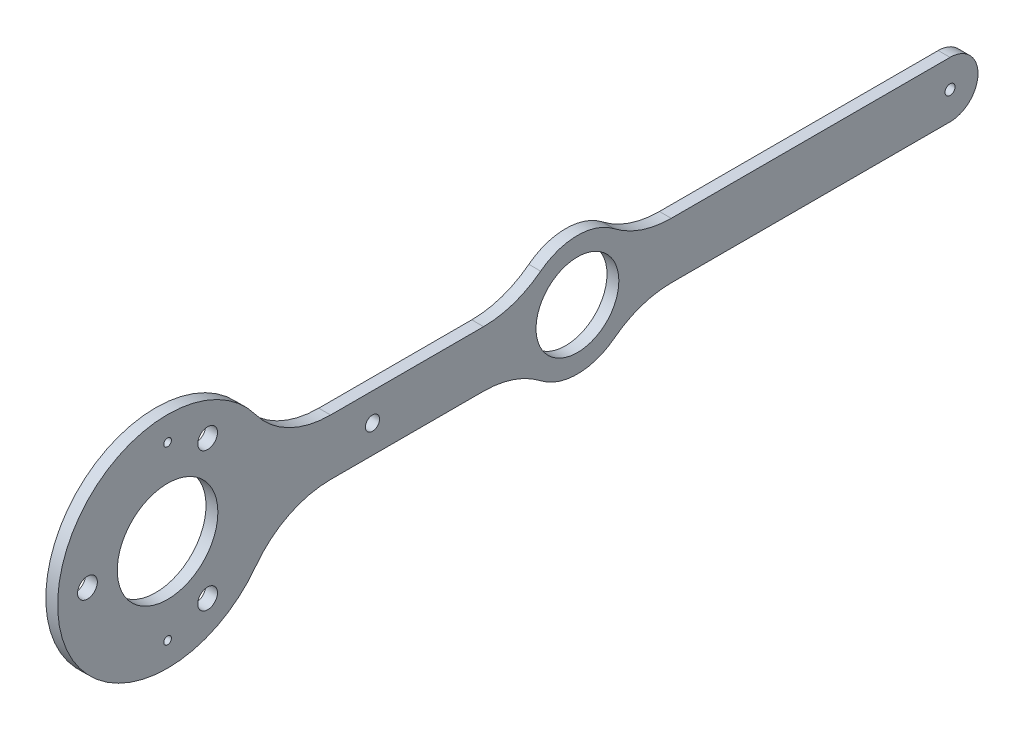
ISO-10303-21;
HEADER;
FILE_DESCRIPTION(('STEP AP214'),'2;1');
FILE_NAME('part.step','',(''),(''),'','','');
FILE_SCHEMA(('AUTOMOTIVE_DESIGN { 1 0 10303 214 1 1 1 1 }'));
ENDSEC;
DATA;
#1=APPLICATION_CONTEXT('core data for automotive mechanical design processes');
#2=APPLICATION_PROTOCOL_DEFINITION('international standard','automotive_design',2000,#1);
#3=PRODUCT_CONTEXT('',#1,'mechanical');
#4=PRODUCT('Part','Part','',(#3));
#5=PRODUCT_RELATED_PRODUCT_CATEGORY('part','',(#4));
#6=PRODUCT_DEFINITION_FORMATION('','',#4);
#7=PRODUCT_DEFINITION_CONTEXT('part definition',#1,'design');
#8=PRODUCT_DEFINITION('design','',#6,#7);
#9=PRODUCT_DEFINITION_SHAPE('','',#8);
#10=(LENGTH_UNIT() NAMED_UNIT(*) SI_UNIT(.MILLI.,.METRE.));
#11=(NAMED_UNIT(*) PLANE_ANGLE_UNIT() SI_UNIT($,.RADIAN.));
#12=(NAMED_UNIT(*) SI_UNIT($,.STERADIAN.) SOLID_ANGLE_UNIT());
#13=UNCERTAINTY_MEASURE_WITH_UNIT(LENGTH_MEASURE(1.E-05),#10,'distance_accuracy_value','');
#14=(GEOMETRIC_REPRESENTATION_CONTEXT(3) GLOBAL_UNCERTAINTY_ASSIGNED_CONTEXT((#13)) GLOBAL_UNIT_ASSIGNED_CONTEXT((#10,
#11,#12)) REPRESENTATION_CONTEXT('',''));
#15=CARTESIAN_POINT('',(0.,0.,0.));
#16=DIRECTION('',(0.,0.,1.));
#17=DIRECTION('',(1.,0.,0.));
#18=AXIS2_PLACEMENT_3D('',#15,#16,#17);
#19=CARTESIAN_POINT('',(3.175,0.,110.));
#20=DIRECTION('',(-1.,0.,0.));
#21=DIRECTION('',(0.,0.,1.));
#22=AXIS2_PLACEMENT_3D('',#19,#20,#21);
#23=CYLINDRICAL_SURFACE('',#22,29.5);
#24=CARTESIAN_POINT('',(3.175,0.,110.));
#25=DIRECTION('',(1.,0.,0.));
#26=DIRECTION('',(0.,0.,-1.));
#27=AXIS2_PLACEMENT_3D('',#24,#25,#26);
#28=CIRCLE('',#27,29.5);
#29=CARTESIAN_POINT('',(3.175,17.5917431192661,86.3191939743227));
#30=VERTEX_POINT('',#29);
#31=CARTESIAN_POINT('',(3.175,-17.5917431192661,86.3191939743227));
#32=VERTEX_POINT('',#31);
#33=EDGE_CURVE('E261',#30,#32,#28,.T.);
#34=ORIENTED_EDGE('',*,*,#33,.F.);
#35=DIRECTION('',(-1.,0.,0.));
#36=VECTOR('',#35,1.);
#37=CARTESIAN_POINT('',(3.175,17.5917431192661,86.3191939743227));
#38=LINE('',#37,#36);
#39=CARTESIAN_POINT('',(0.,17.5917431192661,86.3191939743227));
#40=VERTEX_POINT('',#39);
#41=EDGE_CURVE('E266',#30,#40,#38,.T.);
#42=ORIENTED_EDGE('',*,*,#41,.T.);
#43=CARTESIAN_POINT('',(0.,0.,110.));
#44=DIRECTION('',(1.,0.,0.));
#45=DIRECTION('',(0.,0.,-1.));
#46=AXIS2_PLACEMENT_3D('',#43,#44,#45);
#47=CIRCLE('',#46,29.5);
#48=CARTESIAN_POINT('',(0.,-17.5917431192661,86.3191939743227));
#49=VERTEX_POINT('',#48);
#50=EDGE_CURVE('E212',#40,#49,#47,.T.);
#51=ORIENTED_EDGE('',*,*,#50,.T.);
#52=DIRECTION('',(-1.,0.,0.));
#53=VECTOR('',#52,1.);
#54=CARTESIAN_POINT('',(3.175,-17.5917431192661,86.3191939743227));
#55=LINE('',#54,#53);
#56=EDGE_CURVE('E171',#49,#32,#55,.F.);
#57=ORIENTED_EDGE('',*,*,#56,.T.);
#58=EDGE_LOOP('',(#34,#42,#51,#57));
#59=FACE_BOUND('',#58,.T.);
#60=ADVANCED_FACE('F45',(#59),#23,.T.);
#61=CARTESIAN_POINT('',(3.175,-7.5,0.));
#62=DIRECTION('',(0.,1.,0.));
#63=DIRECTION('',(0.,0.,1.));
#64=AXIS2_PLACEMENT_3D('',#61,#62,#63);
#65=PLANE('',#64);
#66=DIRECTION('',(0.,0.,-1.));
#67=VECTOR('',#66,1.);
#68=CARTESIAN_POINT('',(3.175,-7.5,0.));
#69=LINE('',#68,#67);
#70=CARTESIAN_POINT('',(3.175,-7.5,66.2507142915453));
#71=VERTEX_POINT('',#70);
#72=CARTESIAN_POINT('',(3.175,-7.5,25.1791115063657));
#73=VERTEX_POINT('',#72);
#74=EDGE_CURVE('E356',#71,#73,#69,.T.);
#75=ORIENTED_EDGE('',*,*,#74,.F.);
#76=DIRECTION('',(1.,0.,0.));
#77=VECTOR('',#76,1.);
#78=CARTESIAN_POINT('',(0.,-7.5,66.2507142915453));
#79=LINE('',#78,#77);
#80=CARTESIAN_POINT('',(0.,-7.5,66.2507142915453));
#81=VERTEX_POINT('',#80);
#82=EDGE_CURVE('E280',#71,#81,#79,.F.);
#83=ORIENTED_EDGE('',*,*,#82,.T.);
#84=DIRECTION('',(0.,0.,-1.));
#85=VECTOR('',#84,1.);
#86=CARTESIAN_POINT('',(0.,-7.5,0.));
#87=LINE('',#86,#85);
#88=CARTESIAN_POINT('',(0.,-7.5,25.1791115063657));
#89=VERTEX_POINT('',#88);
#90=EDGE_CURVE('E216',#81,#89,#87,.T.);
#91=ORIENTED_EDGE('',*,*,#90,.T.);
#92=DIRECTION('',(1.,0.,0.));
#93=VECTOR('',#92,1.);
#94=CARTESIAN_POINT('',(3.175,-7.5,25.1791115063657));
#95=LINE('',#94,#93);
#96=EDGE_CURVE('E277',#89,#73,#95,.T.);
#97=ORIENTED_EDGE('',*,*,#96,.T.);
#98=EDGE_LOOP('',(#75,#83,#91,#97));
#99=FACE_BOUND('',#98,.T.);
#100=ADVANCED_FACE('F384',(#99),#65,.F.);
#101=CARTESIAN_POINT('',(3.175,0.,0.));
#102=DIRECTION('',(-1.,0.,0.));
#103=DIRECTION('',(0.,0.,1.));
#104=AXIS2_PLACEMENT_3D('',#101,#102,#103);
#105=CYLINDRICAL_SURFACE('',#104,16.1125);
#106=CARTESIAN_POINT('',(3.175,0.,0.));
#107=DIRECTION('',(1.,0.,0.));
#108=DIRECTION('',(0.,0.,-1.));
#109=AXIS2_PLACEMENT_3D('',#106,#107,#108);
#110=CIRCLE('',#109,16.1125);
#111=CARTESIAN_POINT('',(3.175,-12.7371541501976,9.86800691143369));
#112=VERTEX_POINT('',#111);
#113=CARTESIAN_POINT('',(3.175,-12.7371541501976,-9.8680069114337));
#114=VERTEX_POINT('',#113);
#115=EDGE_CURVE('E160',#112,#114,#110,.T.);
#116=ORIENTED_EDGE('',*,*,#115,.F.);
#117=DIRECTION('',(-1.,0.,0.));
#118=VECTOR('',#117,1.);
#119=CARTESIAN_POINT('',(3.175,-12.7371541501976,9.86800691143369));
#120=LINE('',#119,#118);
#121=CARTESIAN_POINT('',(0.,-12.7371541501976,9.86800691143369));
#122=VERTEX_POINT('',#121);
#123=EDGE_CURVE('E287',#112,#122,#120,.T.);
#124=ORIENTED_EDGE('',*,*,#123,.T.);
#125=CARTESIAN_POINT('',(0.,0.,0.));
#126=DIRECTION('',(1.,0.,0.));
#127=DIRECTION('',(0.,0.,-1.));
#128=AXIS2_PLACEMENT_3D('',#125,#126,#127);
#129=CIRCLE('',#128,16.1125);
#130=CARTESIAN_POINT('',(0.,-12.7371541501976,-9.8680069114337));
#131=VERTEX_POINT('',#130);
#132=EDGE_CURVE('E221',#122,#131,#129,.T.);
#133=ORIENTED_EDGE('',*,*,#132,.T.);
#134=DIRECTION('',(-1.,0.,0.));
#135=VECTOR('',#134,1.);
#136=CARTESIAN_POINT('',(3.175,-12.7371541501976,-9.8680069114337));
#137=LINE('',#136,#135);
#138=EDGE_CURVE('E284',#131,#114,#137,.F.);
#139=ORIENTED_EDGE('',*,*,#138,.T.);
#140=EDGE_LOOP('',(#116,#124,#133,#139));
#141=FACE_BOUND('',#140,.T.);
#142=ADVANCED_FACE('F389',(#141),#105,.T.);
#143=CARTESIAN_POINT('',(3.175,-7.50000000000001,0.));
#144=DIRECTION('',(0.,1.,0.));
#145=DIRECTION('',(0.,0.,1.));
#146=AXIS2_PLACEMENT_3D('',#143,#144,#145);
#147=PLANE('',#146);
#148=DIRECTION('',(0.,0.,-1.));
#149=VECTOR('',#148,1.);
#150=CARTESIAN_POINT('',(3.175,-7.50000000000001,0.));
#151=LINE('',#150,#149);
#152=CARTESIAN_POINT('',(3.175,-7.5,-25.1791115063657));
#153=VERTEX_POINT('',#152);
#154=CARTESIAN_POINT('',(3.175,-7.49999999999996,-100.));
#155=VERTEX_POINT('',#154);
#156=EDGE_CURVE('E146',#153,#155,#151,.T.);
#157=ORIENTED_EDGE('',*,*,#156,.F.);
#158=DIRECTION('',(1.,0.,0.));
#159=VECTOR('',#158,1.);
#160=CARTESIAN_POINT('',(0.,-7.5,-25.1791115063657));
#161=LINE('',#160,#159);
#162=CARTESIAN_POINT('',(0.,-7.5,-25.1791115063657));
#163=VERTEX_POINT('',#162);
#164=EDGE_CURVE('E291',#153,#163,#161,.F.);
#165=ORIENTED_EDGE('',*,*,#164,.T.);
#166=DIRECTION('',(0.,0.,-1.));
#167=VECTOR('',#166,1.);
#168=CARTESIAN_POINT('',(0.,-7.50000000000001,0.));
#169=LINE('',#168,#167);
#170=CARTESIAN_POINT('',(0.,-7.49999999999996,-100.));
#171=VERTEX_POINT('',#170);
#172=EDGE_CURVE('E166',#163,#171,#169,.T.);
#173=ORIENTED_EDGE('',*,*,#172,.T.);
#174=DIRECTION('',(-1.,0.,0.));
#175=VECTOR('',#174,1.);
#176=CARTESIAN_POINT('',(3.175,-7.49999999999996,-100.));
#177=LINE('',#176,#175);
#178=EDGE_CURVE('E163',#155,#171,#177,.T.);
#179=ORIENTED_EDGE('',*,*,#178,.F.);
#180=EDGE_LOOP('',(#157,#165,#173,#179));
#181=FACE_BOUND('',#180,.T.);
#182=ADVANCED_FACE('F164',(#181),#147,.F.);
#183=CARTESIAN_POINT('',(3.175,0.,-100.));
#184=DIRECTION('',(-1.,0.,0.));
#185=DIRECTION('',(0.,0.,1.));
#186=AXIS2_PLACEMENT_3D('',#183,#184,#185);
#187=CYLINDRICAL_SURFACE('',#186,7.5);
#188=CARTESIAN_POINT('',(0.,0.,-100.));
#189=DIRECTION('',(1.,0.,0.));
#190=DIRECTION('',(0.,0.,-1.));
#191=AXIS2_PLACEMENT_3D('',#188,#189,#190);
#192=CIRCLE('',#191,7.5);
#193=CARTESIAN_POINT('',(0.,7.50000000000004,-100.));
#194=VERTEX_POINT('',#193);
#195=EDGE_CURVE('E227',#194,#171,#192,.F.);
#196=ORIENTED_EDGE('',*,*,#195,.F.);
#197=DIRECTION('',(-1.,0.,0.));
#198=VECTOR('',#197,1.);
#199=CARTESIAN_POINT('',(3.175,7.50000000000004,-100.));
#200=LINE('',#199,#198);
#201=CARTESIAN_POINT('',(3.175,7.50000000000004,-100.));
#202=VERTEX_POINT('',#201);
#203=EDGE_CURVE('E172',#202,#194,#200,.T.);
#204=ORIENTED_EDGE('',*,*,#203,.F.);
#205=CARTESIAN_POINT('',(3.175,0.,-100.));
#206=DIRECTION('',(1.,0.,0.));
#207=DIRECTION('',(0.,0.,-1.));
#208=AXIS2_PLACEMENT_3D('',#205,#206,#207);
#209=CIRCLE('',#208,7.5);
#210=EDGE_CURVE('E152',#202,#155,#209,.F.);
#211=ORIENTED_EDGE('',*,*,#210,.T.);
#212=ORIENTED_EDGE('',*,*,#178,.T.);
#213=EDGE_LOOP('',(#196,#204,#211,#212));
#214=FACE_BOUND('',#213,.T.);
#215=ADVANCED_FACE('F175',(#214),#187,.T.);
#216=CARTESIAN_POINT('',(3.175,7.49999999999999,0.));
#217=DIRECTION('',(0.,1.,0.));
#218=DIRECTION('',(0.,0.,1.));
#219=AXIS2_PLACEMENT_3D('',#216,#217,#218);
#220=PLANE('',#219);
#221=DIRECTION('',(0.,0.,-1.));
#222=VECTOR('',#221,1.);
#223=CARTESIAN_POINT('',(0.,7.49999999999999,0.));
#224=LINE('',#223,#222);
#225=CARTESIAN_POINT('',(0.,7.5,-25.1791115063658));
#226=VERTEX_POINT('',#225);
#227=EDGE_CURVE('E230',#226,#194,#224,.T.);
#228=ORIENTED_EDGE('',*,*,#227,.F.);
#229=DIRECTION('',(-1.,0.,0.));
#230=VECTOR('',#229,1.);
#231=CARTESIAN_POINT('',(3.175,7.5,-25.1791115063658));
#232=LINE('',#231,#230);
#233=CARTESIAN_POINT('',(3.175,7.5,-25.1791115063658));
#234=VERTEX_POINT('',#233);
#235=EDGE_CURVE('E61',#226,#234,#232,.F.);
#236=ORIENTED_EDGE('',*,*,#235,.T.);
#237=DIRECTION('',(0.,0.,-1.));
#238=VECTOR('',#237,1.);
#239=CARTESIAN_POINT('',(3.175,7.49999999999999,0.));
#240=LINE('',#239,#238);
#241=EDGE_CURVE('E178',#234,#202,#240,.T.);
#242=ORIENTED_EDGE('',*,*,#241,.T.);
#243=ORIENTED_EDGE('',*,*,#203,.T.);
#244=EDGE_LOOP('',(#228,#236,#242,#243));
#245=FACE_BOUND('',#244,.T.);
#246=ADVANCED_FACE('F372',(#245),#220,.T.);
#247=CARTESIAN_POINT('',(3.175,0.,0.));
#248=DIRECTION('',(-1.,0.,0.));
#249=DIRECTION('',(0.,0.,1.));
#250=AXIS2_PLACEMENT_3D('',#247,#248,#249);
#251=CYLINDRICAL_SURFACE('',#250,16.1125);
#252=CARTESIAN_POINT('',(3.175,0.,0.));
#253=DIRECTION('',(1.,0.,0.));
#254=DIRECTION('',(0.,0.,-1.));
#255=AXIS2_PLACEMENT_3D('',#252,#253,#254);
#256=CIRCLE('',#255,16.1125);
#257=CARTESIAN_POINT('',(3.175,12.7371541501976,-9.8680069114337));
#258=VERTEX_POINT('',#257);
#259=CARTESIAN_POINT('',(3.175,12.7371541501976,9.8680069114337));
#260=VERTEX_POINT('',#259);
#261=EDGE_CURVE('E181',#258,#260,#256,.T.);
#262=ORIENTED_EDGE('',*,*,#261,.F.);
#263=DIRECTION('',(-1.,0.,0.));
#264=VECTOR('',#263,1.);
#265=CARTESIAN_POINT('',(3.175,12.7371541501976,-9.86800691143369));
#266=LINE('',#265,#264);
#267=CARTESIAN_POINT('',(0.,12.7371541501976,-9.8680069114337));
#268=VERTEX_POINT('',#267);
#269=EDGE_CURVE('E297',#258,#268,#266,.T.);
#270=ORIENTED_EDGE('',*,*,#269,.T.);
#271=CARTESIAN_POINT('',(0.,0.,0.));
#272=DIRECTION('',(1.,0.,0.));
#273=DIRECTION('',(0.,0.,-1.));
#274=AXIS2_PLACEMENT_3D('',#271,#272,#273);
#275=CIRCLE('',#274,16.1125);
#276=CARTESIAN_POINT('',(0.,12.7371541501976,9.8680069114337));
#277=VERTEX_POINT('',#276);
#278=EDGE_CURVE('E233',#268,#277,#275,.T.);
#279=ORIENTED_EDGE('',*,*,#278,.T.);
#280=DIRECTION('',(-1.,0.,0.));
#281=VECTOR('',#280,1.);
#282=CARTESIAN_POINT('',(3.175,12.7371541501976,9.8680069114337));
#283=LINE('',#282,#281);
#284=EDGE_CURVE('E294',#277,#260,#283,.F.);
#285=ORIENTED_EDGE('',*,*,#284,.T.);
#286=EDGE_LOOP('',(#262,#270,#279,#285));
#287=FACE_BOUND('',#286,.T.);
#288=ADVANCED_FACE('F340',(#287),#251,.T.);
#289=CARTESIAN_POINT('',(3.175,-1.90914435981862E-13,131.5));
#290=DIRECTION('',(-1.,0.,0.));
#291=DIRECTION('',(0.,0.,1.));
#292=AXIS2_PLACEMENT_3D('',#289,#290,#291);
#293=CYLINDRICAL_SURFACE('',#292,2.65000000000007);
#294=CARTESIAN_POINT('',(3.175,-1.90914435981862E-13,131.5));
#295=DIRECTION('',(1.,0.,0.));
#296=DIRECTION('',(0.,0.,-1.));
#297=AXIS2_PLACEMENT_3D('',#294,#295,#296);
#298=CIRCLE('',#297,2.65000000000007);
#299=CARTESIAN_POINT('',(3.175,-1.90914435981862E-13,128.85));
#300=VERTEX_POINT('',#299);
#301=EDGE_CURVE('E204',#300,#300,#298,.T.);
#302=ORIENTED_EDGE('',*,*,#301,.T.);
#303=EDGE_LOOP('',(#302));
#304=FACE_BOUND('',#303,.T.);
#305=CARTESIAN_POINT('',(0.,-1.90914435981862E-13,131.5));
#306=DIRECTION('',(1.,0.,0.));
#307=DIRECTION('',(0.,0.,-1.));
#308=AXIS2_PLACEMENT_3D('',#305,#306,#307);
#309=CIRCLE('',#308,2.65000000000007);
#310=CARTESIAN_POINT('',(0.,-1.90914435981862E-13,128.85));
#311=VERTEX_POINT('',#310);
#312=EDGE_CURVE('E253',#311,#311,#309,.T.);
#313=ORIENTED_EDGE('',*,*,#312,.F.);
#314=EDGE_LOOP('',(#313));
#315=FACE_BOUND('',#314,.T.);
#316=ADVANCED_FACE('F421',(#304,#315),#293,.F.);
#317=CARTESIAN_POINT('',(3.175,18.6195461813655,99.2500000000002));
#318=DIRECTION('',(-1.,0.,0.));
#319=DIRECTION('',(0.,0.,1.));
#320=AXIS2_PLACEMENT_3D('',#317,#318,#319);
#321=CYLINDRICAL_SURFACE('',#320,2.65000000000004);
#322=CARTESIAN_POINT('',(3.175,18.6195461813655,99.2500000000002));
#323=DIRECTION('',(1.,0.,0.));
#324=DIRECTION('',(0.,0.,-1.));
#325=AXIS2_PLACEMENT_3D('',#322,#323,#324);
#326=CIRCLE('',#325,2.65000000000004);
#327=CARTESIAN_POINT('',(3.175,18.6195461813655,96.6000000000002));
#328=VERTEX_POINT('',#327);
#329=EDGE_CURVE('E200',#328,#328,#326,.T.);
#330=ORIENTED_EDGE('',*,*,#329,.T.);
#331=EDGE_LOOP('',(#330));
#332=FACE_BOUND('',#331,.T.);
#333=CARTESIAN_POINT('',(0.,18.6195461813655,99.2500000000002));
#334=DIRECTION('',(1.,0.,0.));
#335=DIRECTION('',(0.,0.,-1.));
#336=AXIS2_PLACEMENT_3D('',#333,#334,#335);
#337=CIRCLE('',#336,2.65000000000004);
#338=CARTESIAN_POINT('',(0.,18.6195461813655,96.6000000000002));
#339=VERTEX_POINT('',#338);
#340=EDGE_CURVE('E249',#339,#339,#337,.T.);
#341=ORIENTED_EDGE('',*,*,#340,.F.);
#342=EDGE_LOOP('',(#341));
#343=FACE_BOUND('',#342,.T.);
#344=ADVANCED_FACE('F432',(#332,#343),#321,.F.);
#345=CARTESIAN_POINT('',(3.175,0.,110.));
#346=DIRECTION('',(-1.,0.,0.));
#347=DIRECTION('',(0.,0.,1.));
#348=AXIS2_PLACEMENT_3D('',#345,#346,#347);
#349=CYLINDRICAL_SURFACE('',#348,13.5);
#350=CARTESIAN_POINT('',(3.175,0.,110.));
#351=DIRECTION('',(1.,0.,0.));
#352=DIRECTION('',(0.,0.,-1.));
#353=AXIS2_PLACEMENT_3D('',#350,#351,#352);
#354=CIRCLE('',#353,13.5);
#355=CARTESIAN_POINT('',(3.175,0.,96.5));
#356=VERTEX_POINT('',#355);
#357=EDGE_CURVE('E196',#356,#356,#354,.T.);
#358=ORIENTED_EDGE('',*,*,#357,.T.);
#359=EDGE_LOOP('',(#358));
#360=FACE_BOUND('',#359,.T.);
#361=CARTESIAN_POINT('',(0.,0.,110.));
#362=DIRECTION('',(1.,0.,0.));
#363=DIRECTION('',(0.,0.,-1.));
#364=AXIS2_PLACEMENT_3D('',#361,#362,#363);
#365=CIRCLE('',#364,13.5);
#366=CARTESIAN_POINT('',(0.,0.,96.5));
#367=VERTEX_POINT('',#366);
#368=EDGE_CURVE('E245',#367,#367,#365,.T.);
#369=ORIENTED_EDGE('',*,*,#368,.F.);
#370=EDGE_LOOP('',(#369));
#371=FACE_BOUND('',#370,.T.);
#372=ADVANCED_FACE('F428',(#360,#371),#349,.F.);
#373=CARTESIAN_POINT('',(3.175,0.,0.));
#374=DIRECTION('',(-1.,0.,0.));
#375=DIRECTION('',(0.,0.,1.));
#376=AXIS2_PLACEMENT_3D('',#373,#374,#375);
#377=CYLINDRICAL_SURFACE('',#376,11.1125);
#378=CARTESIAN_POINT('',(3.175,0.,0.));
#379=DIRECTION('',(1.,0.,0.));
#380=DIRECTION('',(0.,0.,-1.));
#381=AXIS2_PLACEMENT_3D('',#378,#379,#380);
#382=CIRCLE('',#381,11.1125);
#383=CARTESIAN_POINT('',(3.175,0.,-11.1125));
#384=VERTEX_POINT('',#383);
#385=EDGE_CURVE('E192',#384,#384,#382,.T.);
#386=ORIENTED_EDGE('',*,*,#385,.T.);
#387=EDGE_LOOP('',(#386));
#388=FACE_BOUND('',#387,.T.);
#389=CARTESIAN_POINT('',(0.,0.,0.));
#390=DIRECTION('',(1.,0.,0.));
#391=DIRECTION('',(0.,0.,-1.));
#392=AXIS2_PLACEMENT_3D('',#389,#390,#391);
#393=CIRCLE('',#392,11.1125);
#394=CARTESIAN_POINT('',(0.,0.,-11.1125));
#395=VERTEX_POINT('',#394);
#396=EDGE_CURVE('E241',#395,#395,#393,.T.);
#397=ORIENTED_EDGE('',*,*,#396,.F.);
#398=EDGE_LOOP('',(#397));
#399=FACE_BOUND('',#398,.T.);
#400=ADVANCED_FACE('F425',(#388,#399),#377,.F.);
#401=CARTESIAN_POINT('',(3.175,7.5,0.));
#402=DIRECTION('',(0.,1.,0.));
#403=DIRECTION('',(0.,0.,1.));
#404=AXIS2_PLACEMENT_3D('',#401,#402,#403);
#405=PLANE('',#404);
#406=DIRECTION('',(0.,0.,-1.));
#407=VECTOR('',#406,1.);
#408=CARTESIAN_POINT('',(0.,7.5,0.));
#409=LINE('',#408,#407);
#410=CARTESIAN_POINT('',(0.,7.5,66.2507142915453));
#411=VERTEX_POINT('',#410);
#412=CARTESIAN_POINT('',(0.,7.5,25.1791115063657));
#413=VERTEX_POINT('',#412);
#414=EDGE_CURVE('E237',#411,#413,#409,.T.);
#415=ORIENTED_EDGE('',*,*,#414,.F.);
#416=DIRECTION('',(-1.,0.,0.));
#417=VECTOR('',#416,1.);
#418=CARTESIAN_POINT('',(3.175,7.5,66.2507142915453));
#419=LINE('',#418,#417);
#420=CARTESIAN_POINT('',(3.175,7.5,66.2507142915453));
#421=VERTEX_POINT('',#420);
#422=EDGE_CURVE('E274',#411,#421,#419,.F.);
#423=ORIENTED_EDGE('',*,*,#422,.T.);
#424=DIRECTION('',(0.,0.,-1.));
#425=VECTOR('',#424,1.);
#426=CARTESIAN_POINT('',(3.175,7.5,0.));
#427=LINE('',#426,#425);
#428=CARTESIAN_POINT('',(3.175,7.5,25.1791115063657));
#429=VERTEX_POINT('',#428);
#430=EDGE_CURVE('E188',#421,#429,#427,.T.);
#431=ORIENTED_EDGE('',*,*,#430,.T.);
#432=DIRECTION('',(-1.,0.,0.));
#433=VECTOR('',#432,1.);
#434=CARTESIAN_POINT('',(3.175,7.5,25.1791115063657));
#435=LINE('',#434,#433);
#436=EDGE_CURVE('E270',#429,#413,#435,.T.);
#437=ORIENTED_EDGE('',*,*,#436,.T.);
#438=EDGE_LOOP('',(#415,#423,#431,#437));
#439=FACE_BOUND('',#438,.T.);
#440=ADVANCED_FACE('F345',(#439),#405,.T.);
#441=CARTESIAN_POINT('',(3.175,-18.6195461813653,99.2499999999998));
#442=DIRECTION('',(-1.,0.,0.));
#443=DIRECTION('',(0.,0.,1.));
#444=AXIS2_PLACEMENT_3D('',#441,#442,#443);
#445=CYLINDRICAL_SURFACE('',#444,2.64999999999999);
#446=CARTESIAN_POINT('',(3.175,-18.6195461813653,99.2499999999998));
#447=DIRECTION('',(1.,0.,0.));
#448=DIRECTION('',(0.,0.,-1.));
#449=AXIS2_PLACEMENT_3D('',#446,#447,#448);
#450=CIRCLE('',#449,2.64999999999999);
#451=CARTESIAN_POINT('',(3.175,-18.6195461813653,96.5999999999998));
#452=VERTEX_POINT('',#451);
#453=EDGE_CURVE('E208',#452,#452,#450,.T.);
#454=ORIENTED_EDGE('',*,*,#453,.T.);
#455=EDGE_LOOP('',(#454));
#456=FACE_BOUND('',#455,.T.);
#457=CARTESIAN_POINT('',(0.,-18.6195461813653,99.2499999999998));
#458=DIRECTION('',(1.,0.,0.));
#459=DIRECTION('',(0.,0.,-1.));
#460=AXIS2_PLACEMENT_3D('',#457,#458,#459);
#461=CIRCLE('',#460,2.64999999999999);
#462=CARTESIAN_POINT('',(0.,-18.6195461813653,96.5999999999998));
#463=VERTEX_POINT('',#462);
#464=EDGE_CURVE('E257',#463,#463,#461,.T.);
#465=ORIENTED_EDGE('',*,*,#464,.F.);
#466=EDGE_LOOP('',(#465));
#467=FACE_BOUND('',#466,.T.);
#468=ADVANCED_FACE('F424',(#456,#467),#445,.F.);
#469=CARTESIAN_POINT('',(3.175,0.,0.));
#470=DIRECTION('',(1.,0.,0.));
#471=DIRECTION('',(0.,0.,-1.));
#472=AXIS2_PLACEMENT_3D('',#469,#470,#471);
#473=PLANE('',#472);
#474=CARTESIAN_POINT('',(3.175,0.,-100.));
#475=DIRECTION('',(1.,0.,0.));
#476=DIRECTION('',(0.,0.,-1.));
#477=AXIS2_PLACEMENT_3D('',#474,#475,#476);
#478=CIRCLE('',#477,1.35254999999999);
#479=CARTESIAN_POINT('',(3.175,0.,-101.35255));
#480=VERTEX_POINT('',#479);
#481=EDGE_CURVE('E471',#480,#480,#478,.T.);
#482=ORIENTED_EDGE('',*,*,#481,.F.);
#483=EDGE_LOOP('',(#482));
#484=FACE_BOUND('',#483,.T.);
#485=CARTESIAN_POINT('',(3.175,0.,55.));
#486=DIRECTION('',(1.,0.,0.));
#487=DIRECTION('',(0.,0.,-1.));
#488=AXIS2_PLACEMENT_3D('',#485,#486,#487);
#489=CIRCLE('',#488,1.89864999999999);
#490=CARTESIAN_POINT('',(3.175,0.,53.10135));
#491=VERTEX_POINT('',#490);
#492=EDGE_CURVE('E475',#491,#491,#489,.T.);
#493=ORIENTED_EDGE('',*,*,#492,.F.);
#494=EDGE_LOOP('',(#493));
#495=FACE_BOUND('',#494,.T.);
#496=CARTESIAN_POINT('',(3.175,23.015,110.));
#497=DIRECTION('',(1.,0.,0.));
#498=DIRECTION('',(0.,0.,-1.));
#499=AXIS2_PLACEMENT_3D('',#496,#497,#498);
#500=CIRCLE('',#499,1.02499999999999);
#501=CARTESIAN_POINT('',(3.175,23.015,108.975));
#502=VERTEX_POINT('',#501);
#503=EDGE_CURVE('E485',#502,#502,#500,.T.);
#504=ORIENTED_EDGE('',*,*,#503,.F.);
#505=EDGE_LOOP('',(#504));
#506=FACE_BOUND('',#505,.T.);
#507=CARTESIAN_POINT('',(3.175,-23.015,110.));
#508=DIRECTION('',(1.,0.,0.));
#509=DIRECTION('',(0.,0.,-1.));
#510=AXIS2_PLACEMENT_3D('',#507,#508,#509);
#511=CIRCLE('',#510,1.02499999999999);
#512=CARTESIAN_POINT('',(3.175,-23.015,108.975));
#513=VERTEX_POINT('',#512);
#514=EDGE_CURVE('E492',#513,#513,#511,.T.);
#515=ORIENTED_EDGE('',*,*,#514,.F.);
#516=EDGE_LOOP('',(#515));
#517=FACE_BOUND('',#516,.T.);
#518=ORIENTED_EDGE('',*,*,#430,.F.);
#519=CARTESIAN_POINT('',(3.175,32.5,66.2507142915453));
#520=DIRECTION('',(1.,0.,0.));
#521=DIRECTION('',(0.,0.,-1.));
#522=AXIS2_PLACEMENT_3D('',#519,#520,#521);
#523=CIRCLE('',#522,25.);
#524=EDGE_CURVE('E306',#421,#30,#523,.F.);
#525=ORIENTED_EDGE('',*,*,#524,.T.);
#526=ORIENTED_EDGE('',*,*,#33,.T.);
#527=CARTESIAN_POINT('',(3.175,-32.5,66.2507142915453));
#528=DIRECTION('',(1.,0.,0.));
#529=DIRECTION('',(0.,0.,-1.));
#530=AXIS2_PLACEMENT_3D('',#527,#528,#529);
#531=CIRCLE('',#530,25.);
#532=EDGE_CURVE('E312',#32,#71,#531,.F.);
#533=ORIENTED_EDGE('',*,*,#532,.T.);
#534=ORIENTED_EDGE('',*,*,#74,.T.);
#535=CARTESIAN_POINT('',(3.175,-32.5,25.1791115063657));
#536=DIRECTION('',(1.,0.,0.));
#537=DIRECTION('',(0.,0.,-1.));
#538=AXIS2_PLACEMENT_3D('',#535,#536,#537);
#539=CIRCLE('',#538,25.);
#540=EDGE_CURVE('E318',#73,#112,#539,.F.);
#541=ORIENTED_EDGE('',*,*,#540,.T.);
#542=ORIENTED_EDGE('',*,*,#115,.T.);
#543=CARTESIAN_POINT('',(3.175,-32.5,-25.1791115063657));
#544=DIRECTION('',(1.,0.,0.));
#545=DIRECTION('',(0.,0.,-1.));
#546=AXIS2_PLACEMENT_3D('',#543,#544,#545);
#547=CIRCLE('',#546,25.);
#548=EDGE_CURVE('E155',#114,#153,#547,.F.);
#549=ORIENTED_EDGE('',*,*,#548,.T.);
#550=ORIENTED_EDGE('',*,*,#156,.T.);
#551=ORIENTED_EDGE('',*,*,#210,.F.);
#552=ORIENTED_EDGE('',*,*,#241,.F.);
#553=CARTESIAN_POINT('',(3.175,32.5,-25.1791115063657));
#554=DIRECTION('',(1.,0.,0.));
#555=DIRECTION('',(0.,0.,-1.));
#556=AXIS2_PLACEMENT_3D('',#553,#554,#555);
#557=CIRCLE('',#556,25.);
#558=EDGE_CURVE('E328',#234,#258,#557,.F.);
#559=ORIENTED_EDGE('',*,*,#558,.T.);
#560=ORIENTED_EDGE('',*,*,#261,.T.);
#561=CARTESIAN_POINT('',(3.175,32.5,25.1791115063657));
#562=DIRECTION('',(1.,0.,0.));
#563=DIRECTION('',(0.,0.,-1.));
#564=AXIS2_PLACEMENT_3D('',#561,#562,#563);
#565=CIRCLE('',#564,25.);
#566=EDGE_CURVE('E11',#260,#429,#565,.F.);
#567=ORIENTED_EDGE('',*,*,#566,.T.);
#568=EDGE_LOOP('',(#518,#525,#526,#533,#534,#541,#542,#549,#550,#551,#552,#559,#560,#567));
#569=FACE_BOUND('',#568,.T.);
#570=ORIENTED_EDGE('',*,*,#385,.F.);
#571=EDGE_LOOP('',(#570));
#572=FACE_BOUND('',#571,.T.);
#573=ORIENTED_EDGE('',*,*,#357,.F.);
#574=EDGE_LOOP('',(#573));
#575=FACE_BOUND('',#574,.T.);
#576=ORIENTED_EDGE('',*,*,#329,.F.);
#577=EDGE_LOOP('',(#576));
#578=FACE_BOUND('',#577,.T.);
#579=ORIENTED_EDGE('',*,*,#301,.F.);
#580=EDGE_LOOP('',(#579));
#581=FACE_BOUND('',#580,.T.);
#582=ORIENTED_EDGE('',*,*,#453,.F.);
#583=EDGE_LOOP('',(#582));
#584=FACE_BOUND('',#583,.T.);
#585=ADVANCED_FACE('F149',(#484,#495,#506,#517,#569,#572,#575,#578,#581,#584),#473,.T.);
#586=CARTESIAN_POINT('',(0.,0.,0.));
#587=DIRECTION('',(1.,0.,0.));
#588=DIRECTION('',(0.,0.,-1.));
#589=AXIS2_PLACEMENT_3D('',#586,#587,#588);
#590=PLANE('',#589);
#591=CARTESIAN_POINT('',(0.,0.,-100.));
#592=DIRECTION('',(1.,0.,0.));
#593=DIRECTION('',(0.,0.,-1.));
#594=AXIS2_PLACEMENT_3D('',#591,#592,#593);
#595=CIRCLE('',#594,1.35254999999999);
#596=CARTESIAN_POINT('',(0.,0.,-101.35255));
#597=VERTEX_POINT('',#596);
#598=EDGE_CURVE('E468',#597,#597,#595,.T.);
#599=ORIENTED_EDGE('',*,*,#598,.T.);
#600=EDGE_LOOP('',(#599));
#601=FACE_BOUND('',#600,.T.);
#602=CARTESIAN_POINT('',(0.,0.,55.));
#603=DIRECTION('',(1.,0.,0.));
#604=DIRECTION('',(0.,0.,-1.));
#605=AXIS2_PLACEMENT_3D('',#602,#603,#604);
#606=CIRCLE('',#605,1.89864999999999);
#607=CARTESIAN_POINT('',(0.,0.,53.10135));
#608=VERTEX_POINT('',#607);
#609=EDGE_CURVE('E481',#608,#608,#606,.T.);
#610=ORIENTED_EDGE('',*,*,#609,.T.);
#611=EDGE_LOOP('',(#610));
#612=FACE_BOUND('',#611,.T.);
#613=CARTESIAN_POINT('',(0.,23.015,110.));
#614=DIRECTION('',(1.,0.,0.));
#615=DIRECTION('',(0.,0.,-1.));
#616=AXIS2_PLACEMENT_3D('',#613,#614,#615);
#617=CIRCLE('',#616,1.02499999999999);
#618=CARTESIAN_POINT('',(0.,23.015,108.975));
#619=VERTEX_POINT('',#618);
#620=EDGE_CURVE('E489',#619,#619,#617,.T.);
#621=ORIENTED_EDGE('',*,*,#620,.T.);
#622=EDGE_LOOP('',(#621));
#623=FACE_BOUND('',#622,.T.);
#624=CARTESIAN_POINT('',(0.,-23.015,110.));
#625=DIRECTION('',(1.,0.,0.));
#626=DIRECTION('',(0.,0.,-1.));
#627=AXIS2_PLACEMENT_3D('',#624,#625,#626);
#628=CIRCLE('',#627,1.02499999999999);
#629=CARTESIAN_POINT('',(0.,-23.015,108.975));
#630=VERTEX_POINT('',#629);
#631=EDGE_CURVE('E217',#630,#630,#628,.T.);
#632=ORIENTED_EDGE('',*,*,#631,.T.);
#633=EDGE_LOOP('',(#632));
#634=FACE_BOUND('',#633,.T.);
#635=ORIENTED_EDGE('',*,*,#50,.F.);
#636=CARTESIAN_POINT('',(0.,32.5,66.2507142915453));
#637=DIRECTION('',(1.,0.,0.));
#638=DIRECTION('',(0.,0.,-1.));
#639=AXIS2_PLACEMENT_3D('',#636,#637,#638);
#640=CIRCLE('',#639,25.);
#641=EDGE_CURVE('E303',#40,#411,#640,.T.);
#642=ORIENTED_EDGE('',*,*,#641,.T.);
#643=ORIENTED_EDGE('',*,*,#414,.T.);
#644=CARTESIAN_POINT('',(0.,32.5,25.1791115063657));
#645=DIRECTION('',(1.,0.,0.));
#646=DIRECTION('',(0.,0.,-1.));
#647=AXIS2_PLACEMENT_3D('',#644,#645,#646);
#648=CIRCLE('',#647,25.);
#649=EDGE_CURVE('E54',#413,#277,#648,.T.);
#650=ORIENTED_EDGE('',*,*,#649,.T.);
#651=ORIENTED_EDGE('',*,*,#278,.F.);
#652=CARTESIAN_POINT('',(0.,32.5,-25.1791115063657));
#653=DIRECTION('',(1.,0.,0.));
#654=DIRECTION('',(0.,0.,-1.));
#655=AXIS2_PLACEMENT_3D('',#652,#653,#654);
#656=CIRCLE('',#655,25.);
#657=EDGE_CURVE('E69',#268,#226,#656,.T.);
#658=ORIENTED_EDGE('',*,*,#657,.T.);
#659=ORIENTED_EDGE('',*,*,#227,.T.);
#660=ORIENTED_EDGE('',*,*,#195,.T.);
#661=ORIENTED_EDGE('',*,*,#172,.F.);
#662=CARTESIAN_POINT('',(0.,-32.5,-25.1791115063657));
#663=DIRECTION('',(1.,0.,0.));
#664=DIRECTION('',(0.,0.,-1.));
#665=AXIS2_PLACEMENT_3D('',#662,#663,#664);
#666=CIRCLE('',#665,25.);
#667=EDGE_CURVE('E321',#163,#131,#666,.T.);
#668=ORIENTED_EDGE('',*,*,#667,.T.);
#669=ORIENTED_EDGE('',*,*,#132,.F.);
#670=CARTESIAN_POINT('',(0.,-32.5,25.1791115063657));
#671=DIRECTION('',(1.,0.,0.));
#672=DIRECTION('',(0.,0.,-1.));
#673=AXIS2_PLACEMENT_3D('',#670,#671,#672);
#674=CIRCLE('',#673,25.);
#675=EDGE_CURVE('E315',#122,#89,#674,.T.);
#676=ORIENTED_EDGE('',*,*,#675,.T.);
#677=ORIENTED_EDGE('',*,*,#90,.F.);
#678=CARTESIAN_POINT('',(0.,-32.5,66.2507142915453));
#679=DIRECTION('',(1.,0.,0.));
#680=DIRECTION('',(0.,0.,-1.));
#681=AXIS2_PLACEMENT_3D('',#678,#679,#680);
#682=CIRCLE('',#681,25.);
#683=EDGE_CURVE('E309',#81,#49,#682,.T.);
#684=ORIENTED_EDGE('',*,*,#683,.T.);
#685=EDGE_LOOP('',(#635,#642,#643,#650,#651,#658,#659,#660,#661,#668,#669,#676,#677,#684));
#686=FACE_BOUND('',#685,.T.);
#687=ORIENTED_EDGE('',*,*,#396,.T.);
#688=EDGE_LOOP('',(#687));
#689=FACE_BOUND('',#688,.T.);
#690=ORIENTED_EDGE('',*,*,#368,.T.);
#691=EDGE_LOOP('',(#690));
#692=FACE_BOUND('',#691,.T.);
#693=ORIENTED_EDGE('',*,*,#340,.T.);
#694=EDGE_LOOP('',(#693));
#695=FACE_BOUND('',#694,.T.);
#696=ORIENTED_EDGE('',*,*,#312,.T.);
#697=EDGE_LOOP('',(#696));
#698=FACE_BOUND('',#697,.T.);
#699=ORIENTED_EDGE('',*,*,#464,.T.);
#700=EDGE_LOOP('',(#699));
#701=FACE_BOUND('',#700,.T.);
#702=ADVANCED_FACE('F332',(#601,#612,#623,#634,#686,#689,#692,#695,#698,#701),#590,.F.);
#703=CARTESIAN_POINT('',(3.175,-23.015,110.));
#704=DIRECTION('',(1.,0.,0.));
#705=DIRECTION('',(0.,0.,-1.));
#706=AXIS2_PLACEMENT_3D('',#703,#704,#705);
#707=CYLINDRICAL_SURFACE('',#706,1.02499999999999);
#708=ORIENTED_EDGE('',*,*,#631,.F.);
#709=EDGE_LOOP('',(#708));
#710=FACE_BOUND('',#709,.T.);
#711=ORIENTED_EDGE('',*,*,#514,.T.);
#712=EDGE_LOOP('',(#711));
#713=FACE_BOUND('',#712,.T.);
#714=ADVANCED_FACE('F445',(#710,#713),#707,.F.);
#715=CARTESIAN_POINT('',(3.175,23.015,110.));
#716=DIRECTION('',(1.,0.,0.));
#717=DIRECTION('',(0.,0.,-1.));
#718=AXIS2_PLACEMENT_3D('',#715,#716,#717);
#719=CYLINDRICAL_SURFACE('',#718,1.02499999999999);
#720=ORIENTED_EDGE('',*,*,#620,.F.);
#721=EDGE_LOOP('',(#720));
#722=FACE_BOUND('',#721,.T.);
#723=ORIENTED_EDGE('',*,*,#503,.T.);
#724=EDGE_LOOP('',(#723));
#725=FACE_BOUND('',#724,.T.);
#726=ADVANCED_FACE('F452',(#722,#725),#719,.F.);
#727=CARTESIAN_POINT('',(3.175,0.,55.));
#728=DIRECTION('',(1.,0.,0.));
#729=DIRECTION('',(0.,0.,-1.));
#730=AXIS2_PLACEMENT_3D('',#727,#728,#729);
#731=CYLINDRICAL_SURFACE('',#730,1.89864999999999);
#732=ORIENTED_EDGE('',*,*,#609,.F.);
#733=EDGE_LOOP('',(#732));
#734=FACE_BOUND('',#733,.T.);
#735=ORIENTED_EDGE('',*,*,#492,.T.);
#736=EDGE_LOOP('',(#735));
#737=FACE_BOUND('',#736,.T.);
#738=ADVANCED_FACE('F456',(#734,#737),#731,.F.);
#739=CARTESIAN_POINT('',(3.175,0.,-100.));
#740=DIRECTION('',(1.,0.,0.));
#741=DIRECTION('',(0.,0.,-1.));
#742=AXIS2_PLACEMENT_3D('',#739,#740,#741);
#743=CYLINDRICAL_SURFACE('',#742,1.35254999999999);
#744=ORIENTED_EDGE('',*,*,#598,.F.);
#745=EDGE_LOOP('',(#744));
#746=FACE_BOUND('',#745,.T.);
#747=ORIENTED_EDGE('',*,*,#481,.T.);
#748=EDGE_LOOP('',(#747));
#749=FACE_BOUND('',#748,.T.);
#750=ADVANCED_FACE('F397',(#746,#749),#743,.F.);
#751=CARTESIAN_POINT('',(3.175,32.5,66.2507142915453));
#752=DIRECTION('',(-1.,0.,0.));
#753=DIRECTION('',(0.,0.,1.));
#754=AXIS2_PLACEMENT_3D('',#751,#752,#753);
#755=CYLINDRICAL_SURFACE('',#754,25.);
#756=ORIENTED_EDGE('',*,*,#524,.F.);
#757=ORIENTED_EDGE('',*,*,#422,.F.);
#758=ORIENTED_EDGE('',*,*,#641,.F.);
#759=ORIENTED_EDGE('',*,*,#41,.F.);
#760=EDGE_LOOP('',(#756,#757,#758,#759));
#761=FACE_BOUND('',#760,.T.);
#762=ADVANCED_FACE('F348',(#761),#755,.F.);
#763=CARTESIAN_POINT('',(3.175,-32.5,66.2507142915453));
#764=DIRECTION('',(-1.,0.,0.));
#765=DIRECTION('',(0.,0.,1.));
#766=AXIS2_PLACEMENT_3D('',#763,#764,#765);
#767=CYLINDRICAL_SURFACE('',#766,25.);
#768=ORIENTED_EDGE('',*,*,#532,.F.);
#769=ORIENTED_EDGE('',*,*,#56,.F.);
#770=ORIENTED_EDGE('',*,*,#683,.F.);
#771=ORIENTED_EDGE('',*,*,#82,.F.);
#772=EDGE_LOOP('',(#768,#769,#770,#771));
#773=FACE_BOUND('',#772,.T.);
#774=ADVANCED_FACE('F396',(#773),#767,.F.);
#775=CARTESIAN_POINT('',(3.175,-32.5,25.1791115063657));
#776=DIRECTION('',(-1.,0.,0.));
#777=DIRECTION('',(0.,0.,1.));
#778=AXIS2_PLACEMENT_3D('',#775,#776,#777);
#779=CYLINDRICAL_SURFACE('',#778,25.);
#780=ORIENTED_EDGE('',*,*,#540,.F.);
#781=ORIENTED_EDGE('',*,*,#96,.F.);
#782=ORIENTED_EDGE('',*,*,#675,.F.);
#783=ORIENTED_EDGE('',*,*,#123,.F.);
#784=EDGE_LOOP('',(#780,#781,#782,#783));
#785=FACE_BOUND('',#784,.T.);
#786=ADVANCED_FACE('F381',(#785),#779,.F.);
#787=CARTESIAN_POINT('',(3.175,-32.5,-25.1791115063657));
#788=DIRECTION('',(-1.,0.,0.));
#789=DIRECTION('',(0.,0.,1.));
#790=AXIS2_PLACEMENT_3D('',#787,#788,#789);
#791=CYLINDRICAL_SURFACE('',#790,25.);
#792=ORIENTED_EDGE('',*,*,#548,.F.);
#793=ORIENTED_EDGE('',*,*,#138,.F.);
#794=ORIENTED_EDGE('',*,*,#667,.F.);
#795=ORIENTED_EDGE('',*,*,#164,.F.);
#796=EDGE_LOOP('',(#792,#793,#794,#795));
#797=FACE_BOUND('',#796,.T.);
#798=ADVANCED_FACE('F370',(#797),#791,.F.);
#799=CARTESIAN_POINT('',(3.175,32.5,-25.1791115063657));
#800=DIRECTION('',(-1.,0.,0.));
#801=DIRECTION('',(0.,0.,1.));
#802=AXIS2_PLACEMENT_3D('',#799,#800,#801);
#803=CYLINDRICAL_SURFACE('',#802,25.);
#804=ORIENTED_EDGE('',*,*,#558,.F.);
#805=ORIENTED_EDGE('',*,*,#235,.F.);
#806=ORIENTED_EDGE('',*,*,#657,.F.);
#807=ORIENTED_EDGE('',*,*,#269,.F.);
#808=EDGE_LOOP('',(#804,#805,#806,#807));
#809=FACE_BOUND('',#808,.T.);
#810=ADVANCED_FACE('F375',(#809),#803,.F.);
#811=CARTESIAN_POINT('',(3.175,32.5,25.1791115063657));
#812=DIRECTION('',(-1.,0.,0.));
#813=DIRECTION('',(0.,0.,1.));
#814=AXIS2_PLACEMENT_3D('',#811,#812,#813);
#815=CYLINDRICAL_SURFACE('',#814,25.);
#816=ORIENTED_EDGE('',*,*,#566,.F.);
#817=ORIENTED_EDGE('',*,*,#284,.F.);
#818=ORIENTED_EDGE('',*,*,#649,.F.);
#819=ORIENTED_EDGE('',*,*,#436,.F.);
#820=EDGE_LOOP('',(#816,#817,#818,#819));
#821=FACE_BOUND('',#820,.T.);
#822=ADVANCED_FACE('F47',(#821),#815,.F.);
#823=CLOSED_SHELL('',(#60,#100,#142,#182,#215,#246,#288,#316,#344,#372,#400,#440,#468,#585,#702,
#714,#726,#738,#750,#762,#774,#786,#798,#810,#822));
#824=MANIFOLD_SOLID_BREP('B2',#823);
#825=ADVANCED_BREP_SHAPE_REPRESENTATION('',(#18,#824),#14);
#826=SHAPE_DEFINITION_REPRESENTATION(#9,#825);
ENDSEC;
END-ISO-10303-21;
